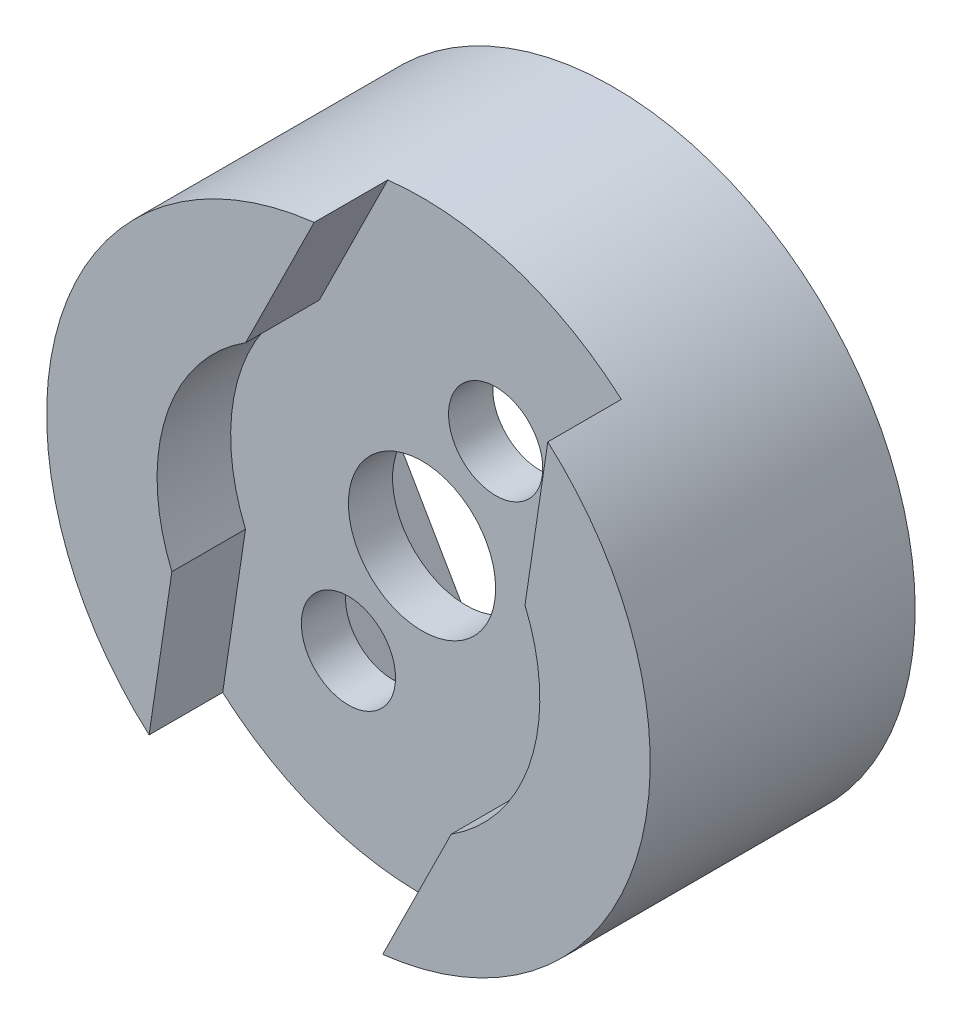
ISO-10303-21;
HEADER;
FILE_DESCRIPTION(('STEP AP214'),'2;1');
FILE_NAME('part.step','',(''),(''),'','','');
FILE_SCHEMA(('AUTOMOTIVE_DESIGN { 1 0 10303 214 1 1 1 1 }'));
ENDSEC;
DATA;
#1=APPLICATION_CONTEXT('core data for automotive mechanical design processes');
#2=APPLICATION_PROTOCOL_DEFINITION('international standard','automotive_design',2000,#1);
#3=PRODUCT_CONTEXT('',#1,'mechanical');
#4=PRODUCT('Part','Part','',(#3));
#5=PRODUCT_RELATED_PRODUCT_CATEGORY('part','',(#4));
#6=PRODUCT_DEFINITION_FORMATION('','',#4);
#7=PRODUCT_DEFINITION_CONTEXT('part definition',#1,'design');
#8=PRODUCT_DEFINITION('design','',#6,#7);
#9=PRODUCT_DEFINITION_SHAPE('','',#8);
#10=(LENGTH_UNIT() NAMED_UNIT(*) SI_UNIT(.MILLI.,.METRE.));
#11=(NAMED_UNIT(*) PLANE_ANGLE_UNIT() SI_UNIT($,.RADIAN.));
#12=(NAMED_UNIT(*) SI_UNIT($,.STERADIAN.) SOLID_ANGLE_UNIT());
#13=UNCERTAINTY_MEASURE_WITH_UNIT(LENGTH_MEASURE(1.E-05),#10,'distance_accuracy_value','');
#14=(GEOMETRIC_REPRESENTATION_CONTEXT(3) GLOBAL_UNCERTAINTY_ASSIGNED_CONTEXT((#13)) GLOBAL_UNIT_ASSIGNED_CONTEXT((#10,
#11,#12)) REPRESENTATION_CONTEXT('',''));
#15=CARTESIAN_POINT('',(0.,0.,0.));
#16=DIRECTION('',(0.,0.,1.));
#17=DIRECTION('',(1.,0.,0.));
#18=AXIS2_PLACEMENT_3D('',#15,#16,#17);
#19=CARTESIAN_POINT('',(0.,0.,9.));
#20=DIRECTION('',(0.,0.,1.));
#21=DIRECTION('',(1.,0.,0.));
#22=AXIS2_PLACEMENT_3D('',#19,#20,#21);
#23=PLANE('',#22);
#24=DIRECTION('',(0.147489243666408,0.989063659732128,0.));
#25=VECTOR('',#24,1.);
#26=CARTESIAN_POINT('',(5.50073066133658,-0.820269349571371,9.));
#27=LINE('',#26,#25);
#28=CARTESIAN_POINT('',(5.99694200470675,2.50732658267403,9.));
#29=VERTEX_POINT('',#28);
#30=CARTESIAN_POINT('',(6.77060894140182,7.69554121310579,9.));
#31=VERTEX_POINT('',#30);
#32=EDGE_CURVE('E11',#29,#31,#27,.T.);
#33=ORIENTED_EDGE('',*,*,#32,.F.);
#34=CARTESIAN_POINT('',(0.,0.,9.));
#35=DIRECTION('',(0.,0.,1.));
#36=DIRECTION('',(1.,0.,0.));
#37=AXIS2_PLACEMENT_3D('',#34,#35,#36);
#38=CIRCLE('',#37,6.5);
#39=CARTESIAN_POINT('',(3.49102729300359,-5.48294888171539,9.));
#40=VERTEX_POINT('',#39);
#41=EDGE_CURVE('E49',#40,#29,#38,.T.);
#42=ORIENTED_EDGE('',*,*,#41,.F.);
#43=DIRECTION('',(0.443752359547475,0.896149453716314,0.));
#44=VECTOR('',#43,1.);
#45=CARTESIAN_POINT('',(4.98398331461538,-2.46795257937628,9.));
#46=LINE('',#45,#44);
#47=CARTESIAN_POINT('',(1.16328785839899,-10.183774416124,9.));
#48=VERTEX_POINT('',#47);
#49=EDGE_CURVE('E181',#48,#40,#46,.T.);
#50=ORIENTED_EDGE('',*,*,#49,.F.);
#51=CARTESIAN_POINT('',(0.,0.,9.));
#52=DIRECTION('',(0.,0.,1.));
#53=DIRECTION('',(1.,0.,0.));
#54=AXIS2_PLACEMENT_3D('',#51,#52,#53);
#55=CIRCLE('',#54,10.25);
#56=EDGE_CURVE('E233',#48,#31,#55,.T.);
#57=ORIENTED_EDGE('',*,*,#56,.T.);
#58=EDGE_LOOP('',(#33,#42,#50,#57));
#59=FACE_BOUND('',#58,.T.);
#60=ADVANCED_FACE('F39',(#59),#23,.T.);
#61=CARTESIAN_POINT('',(0.,0.,0.));
#62=DIRECTION('',(0.,0.,1.));
#63=DIRECTION('',(1.,0.,0.));
#64=AXIS2_PLACEMENT_3D('',#61,#62,#63);
#65=PLANE('',#64);
#66=CARTESIAN_POINT('',(0.,0.,0.));
#67=DIRECTION('',(0.,0.,1.));
#68=DIRECTION('',(1.,0.,0.));
#69=AXIS2_PLACEMENT_3D('',#66,#67,#68);
#70=CIRCLE('',#69,10.25);
#71=CARTESIAN_POINT('',(10.25,0.,0.));
#72=VERTEX_POINT('',#71);
#73=EDGE_CURVE('E172',#72,#72,#70,.T.);
#74=ORIENTED_EDGE('',*,*,#73,.F.);
#75=EDGE_LOOP('',(#74));
#76=FACE_BOUND('',#75,.T.);
#77=DIRECTION('',(-0.5,0.866025403784438,0.));
#78=VECTOR('',#77,1.);
#79=CARTESIAN_POINT('',(9.5,0.,0.));
#80=LINE('',#79,#78);
#81=CARTESIAN_POINT('',(9.5,0.,0.));
#82=VERTEX_POINT('',#81);
#83=CARTESIAN_POINT('',(4.75,8.22724133595217,0.));
#84=VERTEX_POINT('',#83);
#85=EDGE_CURVE('E245',#82,#84,#80,.T.);
#86=ORIENTED_EDGE('',*,*,#85,.T.);
#87=DIRECTION('',(-1.,0.,0.));
#88=VECTOR('',#87,1.);
#89=CARTESIAN_POINT('',(4.75,8.22724133595217,0.));
#90=LINE('',#89,#88);
#91=CARTESIAN_POINT('',(-4.75,8.22724133595217,0.));
#92=VERTEX_POINT('',#91);
#93=EDGE_CURVE('E257',#84,#92,#90,.T.);
#94=ORIENTED_EDGE('',*,*,#93,.T.);
#95=DIRECTION('',(-0.5,-0.866025403784439,0.));
#96=VECTOR('',#95,1.);
#97=CARTESIAN_POINT('',(-4.75,8.22724133595217,0.));
#98=LINE('',#97,#96);
#99=CARTESIAN_POINT('',(-9.5,0.,0.));
#100=VERTEX_POINT('',#99);
#101=EDGE_CURVE('E158',#92,#100,#98,.T.);
#102=ORIENTED_EDGE('',*,*,#101,.T.);
#103=DIRECTION('',(0.5,-0.866025403784438,0.));
#104=VECTOR('',#103,1.);
#105=CARTESIAN_POINT('',(-9.5,0.,0.));
#106=LINE('',#105,#104);
#107=CARTESIAN_POINT('',(-4.75,-8.22724133595217,0.));
#108=VERTEX_POINT('',#107);
#109=EDGE_CURVE('E156',#100,#108,#106,.T.);
#110=ORIENTED_EDGE('',*,*,#109,.T.);
#111=DIRECTION('',(1.,0.,0.));
#112=VECTOR('',#111,1.);
#113=CARTESIAN_POINT('',(-4.75,-8.22724133595217,0.));
#114=LINE('',#113,#112);
#115=CARTESIAN_POINT('',(4.75,-8.22724133595217,0.));
#116=VERTEX_POINT('',#115);
#117=EDGE_CURVE('E136',#108,#116,#114,.T.);
#118=ORIENTED_EDGE('',*,*,#117,.T.);
#119=DIRECTION('',(0.5,0.866025403784439,0.));
#120=VECTOR('',#119,1.);
#121=CARTESIAN_POINT('',(4.75,-8.22724133595217,0.));
#122=LINE('',#121,#120);
#123=EDGE_CURVE('E146',#116,#82,#122,.T.);
#124=ORIENTED_EDGE('',*,*,#123,.T.);
#125=EDGE_LOOP('',(#86,#94,#102,#110,#118,#124));
#126=FACE_BOUND('',#125,.T.);
#127=ADVANCED_FACE('F153',(#76,#126),#65,.F.);
#128=CARTESIAN_POINT('',(0.,0.,5.));
#129=DIRECTION('',(0.,0.,-1.));
#130=DIRECTION('',(-1.,0.,0.));
#131=AXIS2_PLACEMENT_3D('',#128,#129,#130);
#132=CYLINDRICAL_SURFACE('',#131,10.25);
#133=CARTESIAN_POINT('',(0.,0.,6.5));
#134=DIRECTION('',(0.,0.,1.));
#135=DIRECTION('',(1.,0.,0.));
#136=AXIS2_PLACEMENT_3D('',#133,#134,#135);
#137=CIRCLE('',#136,10.25);
#138=CARTESIAN_POINT('',(6.77060894140182,7.69554121310579,6.5));
#139=VERTEX_POINT('',#138);
#140=CARTESIAN_POINT('',(-1.16328785839898,10.183774416124,6.5));
#141=VERTEX_POINT('',#140);
#142=EDGE_CURVE('E194',#139,#141,#137,.T.);
#143=ORIENTED_EDGE('',*,*,#142,.F.);
#144=DIRECTION('',(0.,0.,1.));
#145=VECTOR('',#144,1.);
#146=CARTESIAN_POINT('',(6.77060894140182,7.69554121310579,6.5));
#147=LINE('',#146,#145);
#148=EDGE_CURVE('E231',#139,#31,#147,.T.);
#149=ORIENTED_EDGE('',*,*,#148,.T.);
#150=ORIENTED_EDGE('',*,*,#56,.F.);
#151=DIRECTION('',(0.,0.,1.));
#152=VECTOR('',#151,1.);
#153=CARTESIAN_POINT('',(1.16328785839899,-10.183774416124,6.5));
#154=LINE('',#153,#152);
#155=CARTESIAN_POINT('',(1.16328785839899,-10.183774416124,6.5));
#156=VERTEX_POINT('',#155);
#157=EDGE_CURVE('E237',#156,#48,#154,.T.);
#158=ORIENTED_EDGE('',*,*,#157,.F.);
#159=CARTESIAN_POINT('',(-6.77060894140182,-7.69554121310579,6.5));
#160=VERTEX_POINT('',#159);
#161=EDGE_CURVE('E205',#160,#156,#137,.T.);
#162=ORIENTED_EDGE('',*,*,#161,.F.);
#163=DIRECTION('',(0.,0.,1.));
#164=VECTOR('',#163,1.);
#165=CARTESIAN_POINT('',(-6.77060894140182,-7.69554121310579,6.5));
#166=LINE('',#165,#164);
#167=CARTESIAN_POINT('',(-6.77060894140182,-7.69554121310579,9.));
#168=VERTEX_POINT('',#167);
#169=EDGE_CURVE('E230',#160,#168,#166,.T.);
#170=ORIENTED_EDGE('',*,*,#169,.T.);
#171=CARTESIAN_POINT('',(-1.16328785839898,10.183774416124,9.));
#172=VERTEX_POINT('',#171);
#173=EDGE_CURVE('E242',#172,#168,#55,.T.);
#174=ORIENTED_EDGE('',*,*,#173,.F.);
#175=DIRECTION('',(0.,0.,1.));
#176=VECTOR('',#175,1.);
#177=CARTESIAN_POINT('',(-1.16328785839898,10.183774416124,6.5));
#178=LINE('',#177,#176);
#179=EDGE_CURVE('E58',#141,#172,#178,.T.);
#180=ORIENTED_EDGE('',*,*,#179,.F.);
#181=EDGE_LOOP('',(#143,#149,#150,#158,#162,#170,#174,#180));
#182=FACE_BOUND('',#181,.T.);
#183=ORIENTED_EDGE('',*,*,#73,.T.);
#184=EDGE_LOOP('',(#183));
#185=FACE_BOUND('',#184,.T.);
#186=ADVANCED_FACE('F41',(#182,#185),#132,.T.);
#187=CARTESIAN_POINT('',(9.5,0.,5.));
#188=DIRECTION('',(-0.866025403784439,-0.5,0.));
#189=DIRECTION('',(0.5,-0.866025403784439,0.));
#190=AXIS2_PLACEMENT_3D('',#187,#188,#189);
#191=PLANE('',#190);
#192=ORIENTED_EDGE('',*,*,#85,.F.);
#193=DIRECTION('',(0.,0.,-1.));
#194=VECTOR('',#193,1.);
#195=CARTESIAN_POINT('',(9.5,0.,5.));
#196=LINE('',#195,#194);
#197=CARTESIAN_POINT('',(9.5,0.,5.));
#198=VERTEX_POINT('',#197);
#199=EDGE_CURVE('E142',#198,#82,#196,.T.);
#200=ORIENTED_EDGE('',*,*,#199,.F.);
#201=DIRECTION('',(-0.5,0.866025403784438,0.));
#202=VECTOR('',#201,1.);
#203=CARTESIAN_POINT('',(9.5,0.,5.));
#204=LINE('',#203,#202);
#205=CARTESIAN_POINT('',(4.75,8.22724133595217,5.));
#206=VERTEX_POINT('',#205);
#207=EDGE_CURVE('E151',#198,#206,#204,.T.);
#208=ORIENTED_EDGE('',*,*,#207,.T.);
#209=DIRECTION('',(0.,0.,-1.));
#210=VECTOR('',#209,1.);
#211=CARTESIAN_POINT('',(4.75,8.22724133595217,5.));
#212=LINE('',#211,#210);
#213=EDGE_CURVE('E169',#206,#84,#212,.T.);
#214=ORIENTED_EDGE('',*,*,#213,.T.);
#215=EDGE_LOOP('',(#192,#200,#208,#214));
#216=FACE_BOUND('',#215,.T.);
#217=ADVANCED_FACE('F268',(#216),#191,.T.);
#218=CARTESIAN_POINT('',(4.75,8.22724133595217,5.));
#219=DIRECTION('',(0.,-1.,0.));
#220=DIRECTION('',(0.,0.,-1.));
#221=AXIS2_PLACEMENT_3D('',#218,#219,#220);
#222=PLANE('',#221);
#223=ORIENTED_EDGE('',*,*,#93,.F.);
#224=ORIENTED_EDGE('',*,*,#213,.F.);
#225=DIRECTION('',(-1.,0.,0.));
#226=VECTOR('',#225,1.);
#227=CARTESIAN_POINT('',(4.75,8.22724133595217,5.));
#228=LINE('',#227,#226);
#229=CARTESIAN_POINT('',(-4.75,8.22724133595217,5.));
#230=VERTEX_POINT('',#229);
#231=EDGE_CURVE('E248',#206,#230,#228,.T.);
#232=ORIENTED_EDGE('',*,*,#231,.T.);
#233=DIRECTION('',(0.,0.,-1.));
#234=VECTOR('',#233,1.);
#235=CARTESIAN_POINT('',(-4.75,8.22724133595217,5.));
#236=LINE('',#235,#234);
#237=EDGE_CURVE('E167',#230,#92,#236,.T.);
#238=ORIENTED_EDGE('',*,*,#237,.T.);
#239=EDGE_LOOP('',(#223,#224,#232,#238));
#240=FACE_BOUND('',#239,.T.);
#241=ADVANCED_FACE('F271',(#240),#222,.T.);
#242=CARTESIAN_POINT('',(-4.75,8.22724133595217,5.));
#243=DIRECTION('',(0.866025403784439,-0.5,0.));
#244=DIRECTION('',(0.5,0.866025403784439,0.));
#245=AXIS2_PLACEMENT_3D('',#242,#243,#244);
#246=PLANE('',#245);
#247=ORIENTED_EDGE('',*,*,#101,.F.);
#248=ORIENTED_EDGE('',*,*,#237,.F.);
#249=DIRECTION('',(-0.5,-0.866025403784439,0.));
#250=VECTOR('',#249,1.);
#251=CARTESIAN_POINT('',(-4.75,8.22724133595217,5.));
#252=LINE('',#251,#250);
#253=CARTESIAN_POINT('',(-9.5,0.,5.));
#254=VERTEX_POINT('',#253);
#255=EDGE_CURVE('E98',#230,#254,#252,.T.);
#256=ORIENTED_EDGE('',*,*,#255,.T.);
#257=DIRECTION('',(0.,0.,-1.));
#258=VECTOR('',#257,1.);
#259=CARTESIAN_POINT('',(-9.5,0.,5.));
#260=LINE('',#259,#258);
#261=EDGE_CURVE('E165',#254,#100,#260,.T.);
#262=ORIENTED_EDGE('',*,*,#261,.T.);
#263=EDGE_LOOP('',(#247,#248,#256,#262));
#264=FACE_BOUND('',#263,.T.);
#265=ADVANCED_FACE('F262',(#264),#246,.T.);
#266=CARTESIAN_POINT('',(-9.5,0.,5.));
#267=DIRECTION('',(0.866025403784439,0.5,0.));
#268=DIRECTION('',(-0.5,0.866025403784439,0.));
#269=AXIS2_PLACEMENT_3D('',#266,#267,#268);
#270=PLANE('',#269);
#271=ORIENTED_EDGE('',*,*,#109,.F.);
#272=ORIENTED_EDGE('',*,*,#261,.F.);
#273=DIRECTION('',(0.5,-0.866025403784438,0.));
#274=VECTOR('',#273,1.);
#275=CARTESIAN_POINT('',(-9.5,0.,5.));
#276=LINE('',#275,#274);
#277=CARTESIAN_POINT('',(-4.75,-8.22724133595217,5.));
#278=VERTEX_POINT('',#277);
#279=EDGE_CURVE('E251',#254,#278,#276,.T.);
#280=ORIENTED_EDGE('',*,*,#279,.T.);
#281=DIRECTION('',(0.,0.,-1.));
#282=VECTOR('',#281,1.);
#283=CARTESIAN_POINT('',(-4.75,-8.22724133595217,5.));
#284=LINE('',#283,#282);
#285=EDGE_CURVE('E141',#278,#108,#284,.T.);
#286=ORIENTED_EDGE('',*,*,#285,.T.);
#287=EDGE_LOOP('',(#271,#272,#280,#286));
#288=FACE_BOUND('',#287,.T.);
#289=ADVANCED_FACE('F265',(#288),#270,.T.);
#290=CARTESIAN_POINT('',(-4.75,-8.22724133595217,5.));
#291=DIRECTION('',(0.,1.,0.));
#292=DIRECTION('',(-1.,0.,0.));
#293=AXIS2_PLACEMENT_3D('',#290,#291,#292);
#294=PLANE('',#293);
#295=ORIENTED_EDGE('',*,*,#117,.F.);
#296=ORIENTED_EDGE('',*,*,#285,.F.);
#297=DIRECTION('',(1.,0.,0.));
#298=VECTOR('',#297,1.);
#299=CARTESIAN_POINT('',(-4.75,-8.22724133595217,5.));
#300=LINE('',#299,#298);
#301=CARTESIAN_POINT('',(4.75,-8.22724133595217,5.));
#302=VERTEX_POINT('',#301);
#303=EDGE_CURVE('E138',#278,#302,#300,.T.);
#304=ORIENTED_EDGE('',*,*,#303,.T.);
#305=DIRECTION('',(0.,0.,-1.));
#306=VECTOR('',#305,1.);
#307=CARTESIAN_POINT('',(4.75,-8.22724133595217,5.));
#308=LINE('',#307,#306);
#309=EDGE_CURVE('E131',#302,#116,#308,.T.);
#310=ORIENTED_EDGE('',*,*,#309,.T.);
#311=EDGE_LOOP('',(#295,#296,#304,#310));
#312=FACE_BOUND('',#311,.T.);
#313=ADVANCED_FACE('F133',(#312),#294,.T.);
#314=CARTESIAN_POINT('',(4.75,-8.22724133595217,5.));
#315=DIRECTION('',(-0.866025403784439,0.5,0.));
#316=DIRECTION('',(-0.5,-0.866025403784439,0.));
#317=AXIS2_PLACEMENT_3D('',#314,#315,#316);
#318=PLANE('',#317);
#319=ORIENTED_EDGE('',*,*,#123,.F.);
#320=ORIENTED_EDGE('',*,*,#309,.F.);
#321=DIRECTION('',(0.5,0.866025403784439,0.));
#322=VECTOR('',#321,1.);
#323=CARTESIAN_POINT('',(4.75,-8.22724133595217,5.));
#324=LINE('',#323,#322);
#325=EDGE_CURVE('E162',#302,#198,#324,.T.);
#326=ORIENTED_EDGE('',*,*,#325,.T.);
#327=ORIENTED_EDGE('',*,*,#199,.T.);
#328=EDGE_LOOP('',(#319,#320,#326,#327));
#329=FACE_BOUND('',#328,.T.);
#330=ADVANCED_FACE('F147',(#329),#318,.T.);
#331=CARTESIAN_POINT('',(0.,0.,5.));
#332=DIRECTION('',(0.,0.,1.));
#333=DIRECTION('',(1.,0.,0.));
#334=AXIS2_PLACEMENT_3D('',#331,#332,#333);
#335=PLANE('',#334);
#336=CARTESIAN_POINT('',(0.,0.,5.));
#337=DIRECTION('',(0.,0.,1.));
#338=DIRECTION('',(1.,0.,0.));
#339=AXIS2_PLACEMENT_3D('',#336,#337,#338);
#340=CIRCLE('',#339,2.5);
#341=CARTESIAN_POINT('',(2.5,0.,5.));
#342=VERTEX_POINT('',#341);
#343=EDGE_CURVE('E187',#342,#342,#340,.T.);
#344=ORIENTED_EDGE('',*,*,#343,.T.);
#345=EDGE_LOOP('',(#344));
#346=FACE_BOUND('',#345,.T.);
#347=CARTESIAN_POINT('',(-2.49999999999999,-4.33012701892219,5.));
#348=DIRECTION('',(0.,0.,1.));
#349=DIRECTION('',(1.,0.,0.));
#350=AXIS2_PLACEMENT_3D('',#347,#348,#349);
#351=CIRCLE('',#350,1.6);
#352=CARTESIAN_POINT('',(-0.899999999999992,-4.33012701892219,5.));
#353=VERTEX_POINT('',#352);
#354=EDGE_CURVE('E190',#353,#353,#351,.T.);
#355=ORIENTED_EDGE('',*,*,#354,.T.);
#356=EDGE_LOOP('',(#355));
#357=FACE_BOUND('',#356,.T.);
#358=CARTESIAN_POINT('',(2.50000000000001,4.3301270189222,5.));
#359=DIRECTION('',(0.,0.,1.));
#360=DIRECTION('',(1.,0.,0.));
#361=AXIS2_PLACEMENT_3D('',#358,#359,#360);
#362=CIRCLE('',#361,1.6);
#363=CARTESIAN_POINT('',(4.10000000000001,4.3301270189222,5.));
#364=VERTEX_POINT('',#363);
#365=EDGE_CURVE('E186',#364,#364,#362,.T.);
#366=ORIENTED_EDGE('',*,*,#365,.T.);
#367=EDGE_LOOP('',(#366));
#368=FACE_BOUND('',#367,.T.);
#369=ORIENTED_EDGE('',*,*,#231,.F.);
#370=ORIENTED_EDGE('',*,*,#207,.F.);
#371=ORIENTED_EDGE('',*,*,#325,.F.);
#372=ORIENTED_EDGE('',*,*,#303,.F.);
#373=ORIENTED_EDGE('',*,*,#279,.F.);
#374=ORIENTED_EDGE('',*,*,#255,.F.);
#375=EDGE_LOOP('',(#369,#370,#371,#372,#373,#374));
#376=FACE_BOUND('',#375,.T.);
#377=ADVANCED_FACE('F266',(#346,#357,#368,#376),#335,.F.);
#378=DIRECTION('',(-0.147489243666408,-0.989063659732128,0.));
#379=VECTOR('',#378,1.);
#380=CARTESIAN_POINT('',(-5.50073066133658,0.820269349571372,9.));
#381=LINE('',#380,#379);
#382=CARTESIAN_POINT('',(-5.99694200470675,-2.50732658267403,9.));
#383=VERTEX_POINT('',#382);
#384=EDGE_CURVE('E179',#383,#168,#381,.T.);
#385=ORIENTED_EDGE('',*,*,#384,.F.);
#386=CARTESIAN_POINT('',(0.,0.,9.));
#387=DIRECTION('',(0.,0.,1.));
#388=DIRECTION('',(1.,0.,0.));
#389=AXIS2_PLACEMENT_3D('',#386,#387,#388);
#390=CIRCLE('',#389,6.5);
#391=CARTESIAN_POINT('',(-3.49102729300358,5.48294888171539,9.));
#392=VERTEX_POINT('',#391);
#393=EDGE_CURVE('E177',#392,#383,#390,.T.);
#394=ORIENTED_EDGE('',*,*,#393,.F.);
#395=DIRECTION('',(-0.443752359547475,-0.896149453716314,0.));
#396=VECTOR('',#395,1.);
#397=CARTESIAN_POINT('',(-4.98398331461538,2.46795257937628,9.));
#398=LINE('',#397,#396);
#399=EDGE_CURVE('E175',#172,#392,#398,.T.);
#400=ORIENTED_EDGE('',*,*,#399,.F.);
#401=ORIENTED_EDGE('',*,*,#173,.T.);
#402=EDGE_LOOP('',(#385,#394,#400,#401));
#403=FACE_BOUND('',#402,.T.);
#404=ADVANCED_FACE('F283',(#403),#23,.T.);
#405=CARTESIAN_POINT('',(5.50073066133658,-0.820269349571371,6.5));
#406=DIRECTION('',(0.989063659732128,-0.147489243666408,0.));
#407=DIRECTION('',(0.147489243666408,0.989063659732128,0.));
#408=AXIS2_PLACEMENT_3D('',#405,#406,#407);
#409=PLANE('',#408);
#410=ORIENTED_EDGE('',*,*,#32,.T.);
#411=ORIENTED_EDGE('',*,*,#148,.F.);
#412=DIRECTION('',(0.147489243666408,0.989063659732128,0.));
#413=VECTOR('',#412,1.);
#414=CARTESIAN_POINT('',(5.50073066133658,-0.820269349571371,6.5));
#415=LINE('',#414,#413);
#416=CARTESIAN_POINT('',(5.99694200470675,2.50732658267403,6.5));
#417=VERTEX_POINT('',#416);
#418=EDGE_CURVE('E220',#417,#139,#415,.T.);
#419=ORIENTED_EDGE('',*,*,#418,.F.);
#420=DIRECTION('',(0.,0.,1.));
#421=VECTOR('',#420,1.);
#422=CARTESIAN_POINT('',(5.99694200470675,2.50732658267403,6.5));
#423=LINE('',#422,#421);
#424=EDGE_CURVE('E234',#417,#29,#423,.T.);
#425=ORIENTED_EDGE('',*,*,#424,.T.);
#426=EDGE_LOOP('',(#410,#411,#419,#425));
#427=FACE_BOUND('',#426,.T.);
#428=ADVANCED_FACE('F291',(#427),#409,.F.);
#429=CARTESIAN_POINT('',(0.,0.,6.5));
#430=DIRECTION('',(0.,0.,1.));
#431=DIRECTION('',(1.,0.,0.));
#432=AXIS2_PLACEMENT_3D('',#429,#430,#431);
#433=CYLINDRICAL_SURFACE('',#432,6.5);
#434=ORIENTED_EDGE('',*,*,#41,.T.);
#435=ORIENTED_EDGE('',*,*,#424,.F.);
#436=CARTESIAN_POINT('',(0.,0.,6.5));
#437=DIRECTION('',(0.,0.,1.));
#438=DIRECTION('',(1.,0.,0.));
#439=AXIS2_PLACEMENT_3D('',#436,#437,#438);
#440=CIRCLE('',#439,6.5);
#441=CARTESIAN_POINT('',(3.49102729300359,-5.48294888171539,6.5));
#442=VERTEX_POINT('',#441);
#443=EDGE_CURVE('E217',#442,#417,#440,.T.);
#444=ORIENTED_EDGE('',*,*,#443,.F.);
#445=DIRECTION('',(0.,0.,1.));
#446=VECTOR('',#445,1.);
#447=CARTESIAN_POINT('',(3.49102729300359,-5.48294888171539,6.5));
#448=LINE('',#447,#446);
#449=EDGE_CURVE('E239',#442,#40,#448,.T.);
#450=ORIENTED_EDGE('',*,*,#449,.T.);
#451=EDGE_LOOP('',(#434,#435,#444,#450));
#452=FACE_BOUND('',#451,.T.);
#453=ADVANCED_FACE('F297',(#452),#433,.F.);
#454=CARTESIAN_POINT('',(4.98398331461538,-2.46795257937628,6.5));
#455=DIRECTION('',(0.896149453716314,-0.443752359547475,0.));
#456=DIRECTION('',(0.443752359547475,0.896149453716314,0.));
#457=AXIS2_PLACEMENT_3D('',#454,#455,#456);
#458=PLANE('',#457);
#459=ORIENTED_EDGE('',*,*,#49,.T.);
#460=ORIENTED_EDGE('',*,*,#449,.F.);
#461=DIRECTION('',(0.443752359547475,0.896149453716314,0.));
#462=VECTOR('',#461,1.);
#463=CARTESIAN_POINT('',(4.98398331461538,-2.46795257937628,6.5));
#464=LINE('',#463,#462);
#465=EDGE_CURVE('E214',#156,#442,#464,.T.);
#466=ORIENTED_EDGE('',*,*,#465,.F.);
#467=ORIENTED_EDGE('',*,*,#157,.T.);
#468=EDGE_LOOP('',(#459,#460,#466,#467));
#469=FACE_BOUND('',#468,.T.);
#470=ADVANCED_FACE('F353',(#469),#458,.F.);
#471=CARTESIAN_POINT('',(-5.50073066133658,0.820269349571372,6.5));
#472=DIRECTION('',(-0.989063659732128,0.147489243666408,0.));
#473=DIRECTION('',(-0.147489243666408,-0.989063659732128,0.));
#474=AXIS2_PLACEMENT_3D('',#471,#472,#473);
#475=PLANE('',#474);
#476=ORIENTED_EDGE('',*,*,#384,.T.);
#477=ORIENTED_EDGE('',*,*,#169,.F.);
#478=DIRECTION('',(-0.147489243666408,-0.989063659732128,0.));
#479=VECTOR('',#478,1.);
#480=CARTESIAN_POINT('',(-5.50073066133658,0.820269349571372,6.5));
#481=LINE('',#480,#479);
#482=CARTESIAN_POINT('',(-5.99694200470675,-2.50732658267404,6.5));
#483=VERTEX_POINT('',#482);
#484=EDGE_CURVE('E211',#483,#160,#481,.T.);
#485=ORIENTED_EDGE('',*,*,#484,.F.);
#486=DIRECTION('',(0.,0.,1.));
#487=VECTOR('',#486,1.);
#488=CARTESIAN_POINT('',(-5.99694200470675,-2.50732658267404,6.5));
#489=LINE('',#488,#487);
#490=EDGE_CURVE('E227',#483,#383,#489,.T.);
#491=ORIENTED_EDGE('',*,*,#490,.T.);
#492=EDGE_LOOP('',(#476,#477,#485,#491));
#493=FACE_BOUND('',#492,.T.);
#494=ADVANCED_FACE('F305',(#493),#475,.F.);
#495=CARTESIAN_POINT('',(0.,0.,6.5));
#496=DIRECTION('',(0.,0.,1.));
#497=DIRECTION('',(1.,0.,0.));
#498=AXIS2_PLACEMENT_3D('',#495,#496,#497);
#499=CYLINDRICAL_SURFACE('',#498,6.5);
#500=ORIENTED_EDGE('',*,*,#393,.T.);
#501=ORIENTED_EDGE('',*,*,#490,.F.);
#502=CARTESIAN_POINT('',(0.,0.,6.5));
#503=DIRECTION('',(0.,0.,1.));
#504=DIRECTION('',(1.,0.,0.));
#505=AXIS2_PLACEMENT_3D('',#502,#503,#504);
#506=CIRCLE('',#505,6.5);
#507=CARTESIAN_POINT('',(-3.49102729300358,5.48294888171539,6.5));
#508=VERTEX_POINT('',#507);
#509=EDGE_CURVE('E208',#508,#483,#506,.T.);
#510=ORIENTED_EDGE('',*,*,#509,.F.);
#511=DIRECTION('',(0.,0.,1.));
#512=VECTOR('',#511,1.);
#513=CARTESIAN_POINT('',(-3.49102729300358,5.48294888171539,6.5));
#514=LINE('',#513,#512);
#515=EDGE_CURVE('E224',#508,#392,#514,.T.);
#516=ORIENTED_EDGE('',*,*,#515,.T.);
#517=EDGE_LOOP('',(#500,#501,#510,#516));
#518=FACE_BOUND('',#517,.T.);
#519=ADVANCED_FACE('F339',(#518),#499,.F.);
#520=CARTESIAN_POINT('',(-4.98398331461538,2.46795257937628,6.5));
#521=DIRECTION('',(-0.896149453716314,0.443752359547475,0.));
#522=DIRECTION('',(-0.443752359547475,-0.896149453716314,0.));
#523=AXIS2_PLACEMENT_3D('',#520,#521,#522);
#524=PLANE('',#523);
#525=ORIENTED_EDGE('',*,*,#399,.T.);
#526=ORIENTED_EDGE('',*,*,#515,.F.);
#527=DIRECTION('',(-0.443752359547475,-0.896149453716314,0.));
#528=VECTOR('',#527,1.);
#529=CARTESIAN_POINT('',(-4.98398331461538,2.46795257937628,6.5));
#530=LINE('',#529,#528);
#531=EDGE_CURVE('E204',#141,#508,#530,.T.);
#532=ORIENTED_EDGE('',*,*,#531,.F.);
#533=ORIENTED_EDGE('',*,*,#179,.T.);
#534=EDGE_LOOP('',(#525,#526,#532,#533));
#535=FACE_BOUND('',#534,.T.);
#536=ADVANCED_FACE('F340',(#535),#524,.F.);
#537=CARTESIAN_POINT('',(0.,0.,6.5));
#538=DIRECTION('',(0.,0.,1.));
#539=DIRECTION('',(1.,0.,0.));
#540=AXIS2_PLACEMENT_3D('',#537,#538,#539);
#541=PLANE('',#540);
#542=CARTESIAN_POINT('',(0.,0.,6.5));
#543=DIRECTION('',(0.,0.,1.));
#544=DIRECTION('',(1.,0.,0.));
#545=AXIS2_PLACEMENT_3D('',#542,#543,#544);
#546=CIRCLE('',#545,2.5);
#547=CARTESIAN_POINT('',(2.5,0.,6.5));
#548=VERTEX_POINT('',#547);
#549=EDGE_CURVE('E43',#548,#548,#546,.T.);
#550=ORIENTED_EDGE('',*,*,#549,.F.);
#551=EDGE_LOOP('',(#550));
#552=FACE_BOUND('',#551,.T.);
#553=CARTESIAN_POINT('',(-2.49999999999999,-4.33012701892219,6.5));
#554=DIRECTION('',(0.,0.,1.));
#555=DIRECTION('',(1.,0.,0.));
#556=AXIS2_PLACEMENT_3D('',#553,#554,#555);
#557=CIRCLE('',#556,1.6);
#558=CARTESIAN_POINT('',(-0.899999999999992,-4.33012701892219,6.5));
#559=VERTEX_POINT('',#558);
#560=EDGE_CURVE('E188',#559,#559,#557,.T.);
#561=ORIENTED_EDGE('',*,*,#560,.F.);
#562=EDGE_LOOP('',(#561));
#563=FACE_BOUND('',#562,.T.);
#564=CARTESIAN_POINT('',(2.50000000000001,4.3301270189222,6.5));
#565=DIRECTION('',(0.,0.,1.));
#566=DIRECTION('',(1.,0.,0.));
#567=AXIS2_PLACEMENT_3D('',#564,#565,#566);
#568=CIRCLE('',#567,1.6);
#569=CARTESIAN_POINT('',(4.10000000000001,4.3301270189222,6.5));
#570=VERTEX_POINT('',#569);
#571=EDGE_CURVE('E184',#570,#570,#568,.T.);
#572=ORIENTED_EDGE('',*,*,#571,.F.);
#573=EDGE_LOOP('',(#572));
#574=FACE_BOUND('',#573,.T.);
#575=ORIENTED_EDGE('',*,*,#142,.T.);
#576=ORIENTED_EDGE('',*,*,#531,.T.);
#577=ORIENTED_EDGE('',*,*,#509,.T.);
#578=ORIENTED_EDGE('',*,*,#484,.T.);
#579=ORIENTED_EDGE('',*,*,#161,.T.);
#580=ORIENTED_EDGE('',*,*,#465,.T.);
#581=ORIENTED_EDGE('',*,*,#443,.T.);
#582=ORIENTED_EDGE('',*,*,#418,.T.);
#583=EDGE_LOOP('',(#575,#576,#577,#578,#579,#580,#581,#582));
#584=FACE_BOUND('',#583,.T.);
#585=ADVANCED_FACE('F320',(#552,#563,#574,#584),#541,.T.);
#586=CARTESIAN_POINT('',(2.50000000000001,4.3301270189222,9.));
#587=DIRECTION('',(0.,0.,-1.));
#588=DIRECTION('',(-1.,0.,0.));
#589=AXIS2_PLACEMENT_3D('',#586,#587,#588);
#590=CYLINDRICAL_SURFACE('',#589,1.6);
#591=ORIENTED_EDGE('',*,*,#571,.T.);
#592=EDGE_LOOP('',(#591));
#593=FACE_BOUND('',#592,.T.);
#594=ORIENTED_EDGE('',*,*,#365,.F.);
#595=EDGE_LOOP('',(#594));
#596=FACE_BOUND('',#595,.T.);
#597=ADVANCED_FACE('F346',(#593,#596),#590,.F.);
#598=CARTESIAN_POINT('',(-2.49999999999999,-4.33012701892219,9.));
#599=DIRECTION('',(0.,0.,-1.));
#600=DIRECTION('',(-1.,0.,0.));
#601=AXIS2_PLACEMENT_3D('',#598,#599,#600);
#602=CYLINDRICAL_SURFACE('',#601,1.6);
#603=ORIENTED_EDGE('',*,*,#560,.T.);
#604=EDGE_LOOP('',(#603));
#605=FACE_BOUND('',#604,.T.);
#606=ORIENTED_EDGE('',*,*,#354,.F.);
#607=EDGE_LOOP('',(#606));
#608=FACE_BOUND('',#607,.T.);
#609=ADVANCED_FACE('F360',(#605,#608),#602,.F.);
#610=CARTESIAN_POINT('',(0.,0.,9.));
#611=DIRECTION('',(0.,0.,-1.));
#612=DIRECTION('',(-1.,0.,0.));
#613=AXIS2_PLACEMENT_3D('',#610,#611,#612);
#614=CYLINDRICAL_SURFACE('',#613,2.5);
#615=ORIENTED_EDGE('',*,*,#549,.T.);
#616=EDGE_LOOP('',(#615));
#617=FACE_BOUND('',#616,.T.);
#618=ORIENTED_EDGE('',*,*,#343,.F.);
#619=EDGE_LOOP('',(#618));
#620=FACE_BOUND('',#619,.T.);
#621=ADVANCED_FACE('F364',(#617,#620),#614,.F.);
#622=CLOSED_SHELL('',(#60,#127,#186,#217,#241,#265,#289,#313,#330,#377,#404,#428,#453,#470,#494,
#519,#536,#585,#597,#609,#621));
#623=MANIFOLD_SOLID_BREP('B2',#622);
#624=ADVANCED_BREP_SHAPE_REPRESENTATION('',(#18,#623),#14);
#625=SHAPE_DEFINITION_REPRESENTATION(#9,#624);
ENDSEC;
END-ISO-10303-21;
